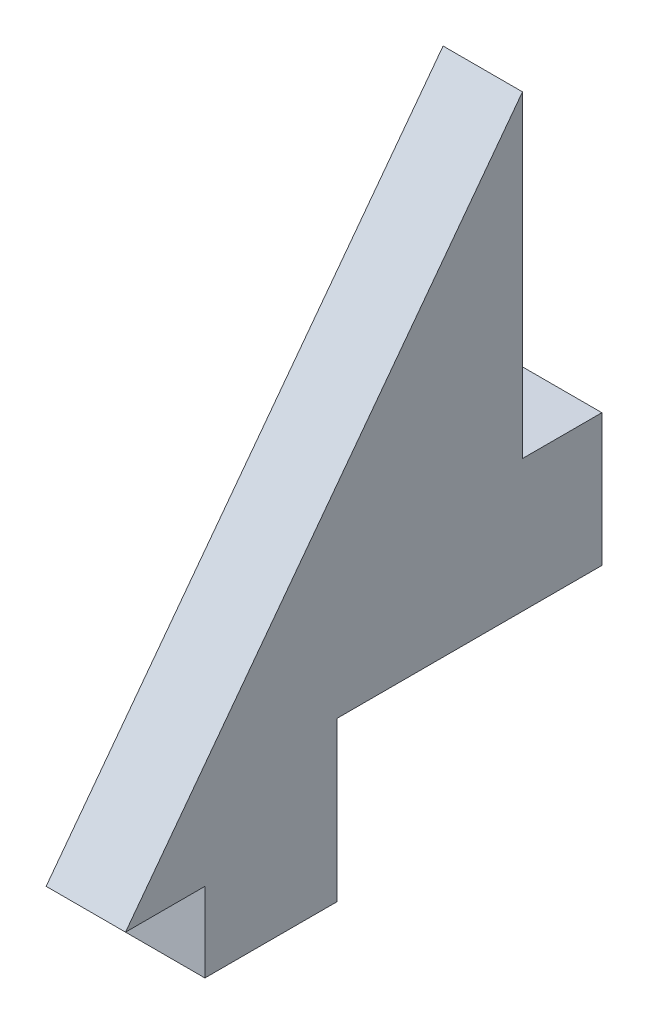
ISO-10303-21;
HEADER;
FILE_DESCRIPTION(('STEP AP214'),'2;1');
FILE_NAME('part.step','',(''),(''),'','','');
FILE_SCHEMA(('AUTOMOTIVE_DESIGN { 1 0 10303 214 1 1 1 1 }'));
ENDSEC;
DATA;
#1=APPLICATION_CONTEXT('core data for automotive mechanical design processes');
#2=APPLICATION_PROTOCOL_DEFINITION('international standard','automotive_design',2000,#1);
#3=PRODUCT_CONTEXT('',#1,'mechanical');
#4=PRODUCT('Part','Part','',(#3));
#5=PRODUCT_RELATED_PRODUCT_CATEGORY('part','',(#4));
#6=PRODUCT_DEFINITION_FORMATION('','',#4);
#7=PRODUCT_DEFINITION_CONTEXT('part definition',#1,'design');
#8=PRODUCT_DEFINITION('design','',#6,#7);
#9=PRODUCT_DEFINITION_SHAPE('','',#8);
#10=(LENGTH_UNIT() NAMED_UNIT(*) SI_UNIT(.MILLI.,.METRE.));
#11=(NAMED_UNIT(*) PLANE_ANGLE_UNIT() SI_UNIT($,.RADIAN.));
#12=(NAMED_UNIT(*) SI_UNIT($,.STERADIAN.) SOLID_ANGLE_UNIT());
#13=UNCERTAINTY_MEASURE_WITH_UNIT(LENGTH_MEASURE(1.E-05),#10,'distance_accuracy_value','');
#14=(GEOMETRIC_REPRESENTATION_CONTEXT(3) GLOBAL_UNCERTAINTY_ASSIGNED_CONTEXT((#13)) GLOBAL_UNIT_ASSIGNED_CONTEXT((#10,
#11,#12)) REPRESENTATION_CONTEXT('',''));
#15=CARTESIAN_POINT('',(0.,0.,0.));
#16=DIRECTION('',(0.,0.,1.));
#17=DIRECTION('',(1.,0.,0.));
#18=AXIS2_PLACEMENT_3D('',#15,#16,#17);
#19=CARTESIAN_POINT('',(3.,8.,0.));
#20=DIRECTION('',(0.,0.,1.));
#21=DIRECTION('',(0.,-1.,0.));
#22=AXIS2_PLACEMENT_3D('',#19,#20,#21);
#23=PLANE('',#22);
#24=DIRECTION('',(0.,1.,0.));
#25=VECTOR('',#24,1.);
#26=CARTESIAN_POINT('',(0.,8.,0.));
#27=LINE('',#26,#25);
#28=CARTESIAN_POINT('',(0.,8.,0.));
#29=VERTEX_POINT('',#28);
#30=CARTESIAN_POINT('',(0.,20.,0.));
#31=VERTEX_POINT('',#30);
#32=EDGE_CURVE('E138',#29,#31,#27,.T.);
#33=ORIENTED_EDGE('',*,*,#32,.T.);
#34=DIRECTION('',(-1.,0.,0.));
#35=VECTOR('',#34,1.);
#36=CARTESIAN_POINT('',(3.,20.,0.));
#37=LINE('',#36,#35);
#38=CARTESIAN_POINT('',(3.,20.,0.));
#39=VERTEX_POINT('',#38);
#40=EDGE_CURVE('E11',#39,#31,#37,.T.);
#41=ORIENTED_EDGE('',*,*,#40,.F.);
#42=DIRECTION('',(0.,1.,0.));
#43=VECTOR('',#42,1.);
#44=CARTESIAN_POINT('',(3.,8.,0.));
#45=LINE('',#44,#43);
#46=CARTESIAN_POINT('',(3.,8.,0.));
#47=VERTEX_POINT('',#46);
#48=EDGE_CURVE('E155',#47,#39,#45,.T.);
#49=ORIENTED_EDGE('',*,*,#48,.F.);
#50=DIRECTION('',(-1.,0.,0.));
#51=VECTOR('',#50,1.);
#52=CARTESIAN_POINT('',(3.,8.,0.));
#53=LINE('',#52,#51);
#54=EDGE_CURVE('E134',#47,#29,#53,.T.);
#55=ORIENTED_EDGE('',*,*,#54,.T.);
#56=EDGE_LOOP('',(#33,#41,#49,#55));
#57=FACE_BOUND('',#56,.T.);
#58=ADVANCED_FACE('F33',(#57),#23,.F.);
#59=CARTESIAN_POINT('',(3.,20.,0.));
#60=DIRECTION('',(0.,-0.6,-0.8));
#61=DIRECTION('',(0.,0.8,-0.6));
#62=AXIS2_PLACEMENT_3D('',#59,#60,#61);
#63=PLANE('',#62);
#64=DIRECTION('',(0.,-0.8,0.6));
#65=VECTOR('',#64,1.);
#66=CARTESIAN_POINT('',(0.,20.,0.));
#67=LINE('',#66,#65);
#68=CARTESIAN_POINT('',(0.,0.,15.));
#69=VERTEX_POINT('',#68);
#70=EDGE_CURVE('E141',#31,#69,#67,.T.);
#71=ORIENTED_EDGE('',*,*,#70,.T.);
#72=DIRECTION('',(-1.,0.,0.));
#73=VECTOR('',#72,1.);
#74=CARTESIAN_POINT('',(3.,0.,15.));
#75=LINE('',#74,#73);
#76=CARTESIAN_POINT('',(3.,0.,15.));
#77=VERTEX_POINT('',#76);
#78=EDGE_CURVE('E40',#77,#69,#75,.T.);
#79=ORIENTED_EDGE('',*,*,#78,.F.);
#80=DIRECTION('',(0.,-0.8,0.6));
#81=VECTOR('',#80,1.);
#82=CARTESIAN_POINT('',(3.,20.,0.));
#83=LINE('',#82,#81);
#84=EDGE_CURVE('E97',#39,#77,#83,.T.);
#85=ORIENTED_EDGE('',*,*,#84,.F.);
#86=ORIENTED_EDGE('',*,*,#40,.T.);
#87=EDGE_LOOP('',(#71,#79,#85,#86));
#88=FACE_BOUND('',#87,.T.);
#89=ADVANCED_FACE('F197',(#88),#63,.F.);
#90=CARTESIAN_POINT('',(3.,0.,15.));
#91=DIRECTION('',(0.,1.,0.));
#92=DIRECTION('',(0.,0.,1.));
#93=AXIS2_PLACEMENT_3D('',#90,#91,#92);
#94=PLANE('',#93);
#95=DIRECTION('',(0.,0.,-1.));
#96=VECTOR('',#95,1.);
#97=CARTESIAN_POINT('',(0.,0.,15.));
#98=LINE('',#97,#96);
#99=CARTESIAN_POINT('',(0.,0.,12.));
#100=VERTEX_POINT('',#99);
#101=EDGE_CURVE('E144',#69,#100,#98,.T.);
#102=ORIENTED_EDGE('',*,*,#101,.T.);
#103=DIRECTION('',(-1.,0.,0.));
#104=VECTOR('',#103,1.);
#105=CARTESIAN_POINT('',(3.,0.,12.));
#106=LINE('',#105,#104);
#107=CARTESIAN_POINT('',(3.,0.,12.));
#108=VERTEX_POINT('',#107);
#109=EDGE_CURVE('E162',#108,#100,#106,.T.);
#110=ORIENTED_EDGE('',*,*,#109,.F.);
#111=DIRECTION('',(0.,0.,-1.));
#112=VECTOR('',#111,1.);
#113=CARTESIAN_POINT('',(3.,0.,15.));
#114=LINE('',#113,#112);
#115=EDGE_CURVE('E170',#77,#108,#114,.T.);
#116=ORIENTED_EDGE('',*,*,#115,.F.);
#117=ORIENTED_EDGE('',*,*,#78,.T.);
#118=EDGE_LOOP('',(#102,#110,#116,#117));
#119=FACE_BOUND('',#118,.T.);
#120=ADVANCED_FACE('F168',(#119),#94,.F.);
#121=CARTESIAN_POINT('',(3.,0.,12.));
#122=DIRECTION('',(0.,0.,-1.));
#123=DIRECTION('',(-1.,0.,0.));
#124=AXIS2_PLACEMENT_3D('',#121,#122,#123);
#125=PLANE('',#124);
#126=DIRECTION('',(0.,-1.,0.));
#127=VECTOR('',#126,1.);
#128=CARTESIAN_POINT('',(0.,0.,12.));
#129=LINE('',#128,#127);
#130=CARTESIAN_POINT('',(0.,-3.,12.));
#131=VERTEX_POINT('',#130);
#132=EDGE_CURVE('E146',#100,#131,#129,.T.);
#133=ORIENTED_EDGE('',*,*,#132,.T.);
#134=DIRECTION('',(-1.,0.,0.));
#135=VECTOR('',#134,1.);
#136=CARTESIAN_POINT('',(3.,-3.,12.));
#137=LINE('',#136,#135);
#138=CARTESIAN_POINT('',(3.,-3.,12.));
#139=VERTEX_POINT('',#138);
#140=EDGE_CURVE('E159',#139,#131,#137,.T.);
#141=ORIENTED_EDGE('',*,*,#140,.F.);
#142=DIRECTION('',(0.,-1.,0.));
#143=VECTOR('',#142,1.);
#144=CARTESIAN_POINT('',(3.,0.,12.));
#145=LINE('',#144,#143);
#146=EDGE_CURVE('E185',#108,#139,#145,.T.);
#147=ORIENTED_EDGE('',*,*,#146,.F.);
#148=ORIENTED_EDGE('',*,*,#109,.T.);
#149=EDGE_LOOP('',(#133,#141,#147,#148));
#150=FACE_BOUND('',#149,.T.);
#151=ADVANCED_FACE('F178',(#150),#125,.F.);
#152=CARTESIAN_POINT('',(3.,-3.,12.));
#153=DIRECTION('',(0.,1.,0.));
#154=DIRECTION('',(0.,0.,1.));
#155=AXIS2_PLACEMENT_3D('',#152,#153,#154);
#156=PLANE('',#155);
#157=DIRECTION('',(0.,0.,-1.));
#158=VECTOR('',#157,1.);
#159=CARTESIAN_POINT('',(0.,-3.,12.));
#160=LINE('',#159,#158);
#161=CARTESIAN_POINT('',(0.,-3.,7.));
#162=VERTEX_POINT('',#161);
#163=EDGE_CURVE('E148',#131,#162,#160,.T.);
#164=ORIENTED_EDGE('',*,*,#163,.T.);
#165=DIRECTION('',(-1.,0.,0.));
#166=VECTOR('',#165,1.);
#167=CARTESIAN_POINT('',(3.,-3.,7.));
#168=LINE('',#167,#166);
#169=CARTESIAN_POINT('',(3.,-3.,7.));
#170=VERTEX_POINT('',#169);
#171=EDGE_CURVE('E129',#170,#162,#168,.T.);
#172=ORIENTED_EDGE('',*,*,#171,.F.);
#173=DIRECTION('',(0.,0.,-1.));
#174=VECTOR('',#173,1.);
#175=CARTESIAN_POINT('',(3.,-3.,12.));
#176=LINE('',#175,#174);
#177=EDGE_CURVE('E184',#139,#170,#176,.T.);
#178=ORIENTED_EDGE('',*,*,#177,.F.);
#179=ORIENTED_EDGE('',*,*,#140,.T.);
#180=EDGE_LOOP('',(#164,#172,#178,#179));
#181=FACE_BOUND('',#180,.T.);
#182=ADVANCED_FACE('F182',(#181),#156,.F.);
#183=CARTESIAN_POINT('',(3.,0.,7.));
#184=DIRECTION('',(0.,0.,1.));
#185=DIRECTION('',(1.,0.,0.));
#186=AXIS2_PLACEMENT_3D('',#183,#184,#185);
#187=PLANE('',#186);
#188=DIRECTION('',(0.,1.,0.));
#189=VECTOR('',#188,1.);
#190=CARTESIAN_POINT('',(0.,0.,7.));
#191=LINE('',#190,#189);
#192=CARTESIAN_POINT('',(0.,3.,7.));
#193=VERTEX_POINT('',#192);
#194=EDGE_CURVE('E47',#162,#193,#191,.T.);
#195=ORIENTED_EDGE('',*,*,#194,.T.);
#196=DIRECTION('',(1.,0.,0.));
#197=VECTOR('',#196,1.);
#198=CARTESIAN_POINT('',(-7.,3.,7.));
#199=LINE('',#198,#197);
#200=CARTESIAN_POINT('',(3.,3.,7.));
#201=VERTEX_POINT('',#200);
#202=EDGE_CURVE('E142',#193,#201,#199,.T.);
#203=ORIENTED_EDGE('',*,*,#202,.T.);
#204=DIRECTION('',(0.,1.,0.));
#205=VECTOR('',#204,1.);
#206=CARTESIAN_POINT('',(3.,0.,7.));
#207=LINE('',#206,#205);
#208=EDGE_CURVE('E119',#170,#201,#207,.T.);
#209=ORIENTED_EDGE('',*,*,#208,.F.);
#210=ORIENTED_EDGE('',*,*,#171,.T.);
#211=EDGE_LOOP('',(#195,#203,#209,#210));
#212=FACE_BOUND('',#211,.T.);
#213=ADVANCED_FACE('F192',(#212),#187,.F.);
#214=CARTESIAN_POINT('',(3.,3.,0.));
#215=DIRECTION('',(0.,1.,0.));
#216=DIRECTION('',(0.,0.,1.));
#217=AXIS2_PLACEMENT_3D('',#214,#215,#216);
#218=PLANE('',#217);
#219=DIRECTION('',(0.,0.,-1.));
#220=VECTOR('',#219,1.);
#221=CARTESIAN_POINT('',(0.,3.,0.));
#222=LINE('',#221,#220);
#223=CARTESIAN_POINT('',(0.,3.,-3.));
#224=VERTEX_POINT('',#223);
#225=EDGE_CURVE('E126',#193,#224,#222,.T.);
#226=ORIENTED_EDGE('',*,*,#225,.T.);
#227=DIRECTION('',(-1.,0.,0.));
#228=VECTOR('',#227,1.);
#229=CARTESIAN_POINT('',(3.,3.,-3.));
#230=LINE('',#229,#228);
#231=CARTESIAN_POINT('',(3.,3.,-3.));
#232=VERTEX_POINT('',#231);
#233=EDGE_CURVE('E124',#232,#224,#230,.T.);
#234=ORIENTED_EDGE('',*,*,#233,.F.);
#235=DIRECTION('',(0.,0.,-1.));
#236=VECTOR('',#235,1.);
#237=CARTESIAN_POINT('',(3.,3.,0.));
#238=LINE('',#237,#236);
#239=EDGE_CURVE('E112',#201,#232,#238,.T.);
#240=ORIENTED_EDGE('',*,*,#239,.F.);
#241=ORIENTED_EDGE('',*,*,#202,.F.);
#242=EDGE_LOOP('',(#226,#234,#240,#241));
#243=FACE_BOUND('',#242,.T.);
#244=ADVANCED_FACE('F125',(#243),#218,.F.);
#245=CARTESIAN_POINT('',(3.,3.,-3.));
#246=DIRECTION('',(0.,0.,1.));
#247=DIRECTION('',(1.,0.,0.));
#248=AXIS2_PLACEMENT_3D('',#245,#246,#247);
#249=PLANE('',#248);
#250=DIRECTION('',(0.,1.,0.));
#251=VECTOR('',#250,1.);
#252=CARTESIAN_POINT('',(0.,3.,-3.));
#253=LINE('',#252,#251);
#254=CARTESIAN_POINT('',(0.,8.,-3.));
#255=VERTEX_POINT('',#254);
#256=EDGE_CURVE('E152',#224,#255,#253,.T.);
#257=ORIENTED_EDGE('',*,*,#256,.T.);
#258=DIRECTION('',(-1.,0.,0.));
#259=VECTOR('',#258,1.);
#260=CARTESIAN_POINT('',(3.,8.,-3.));
#261=LINE('',#260,#259);
#262=CARTESIAN_POINT('',(3.,8.,-3.));
#263=VERTEX_POINT('',#262);
#264=EDGE_CURVE('E130',#263,#255,#261,.T.);
#265=ORIENTED_EDGE('',*,*,#264,.F.);
#266=DIRECTION('',(0.,1.,0.));
#267=VECTOR('',#266,1.);
#268=CARTESIAN_POINT('',(3.,3.,-3.));
#269=LINE('',#268,#267);
#270=EDGE_CURVE('E116',#232,#263,#269,.T.);
#271=ORIENTED_EDGE('',*,*,#270,.F.);
#272=ORIENTED_EDGE('',*,*,#233,.T.);
#273=EDGE_LOOP('',(#257,#265,#271,#272));
#274=FACE_BOUND('',#273,.T.);
#275=ADVANCED_FACE('F132',(#274),#249,.F.);
#276=CARTESIAN_POINT('',(3.,8.,0.));
#277=DIRECTION('',(0.,-1.,0.));
#278=DIRECTION('',(0.,0.,-1.));
#279=AXIS2_PLACEMENT_3D('',#276,#277,#278);
#280=PLANE('',#279);
#281=DIRECTION('',(0.,0.,1.));
#282=VECTOR('',#281,1.);
#283=CARTESIAN_POINT('',(0.,8.,0.));
#284=LINE('',#283,#282);
#285=EDGE_CURVE('E89',#255,#29,#284,.T.);
#286=ORIENTED_EDGE('',*,*,#285,.T.);
#287=ORIENTED_EDGE('',*,*,#54,.F.);
#288=DIRECTION('',(0.,0.,1.));
#289=VECTOR('',#288,1.);
#290=CARTESIAN_POINT('',(3.,8.,0.));
#291=LINE('',#290,#289);
#292=EDGE_CURVE('E56',#263,#47,#291,.T.);
#293=ORIENTED_EDGE('',*,*,#292,.F.);
#294=ORIENTED_EDGE('',*,*,#264,.T.);
#295=EDGE_LOOP('',(#286,#287,#293,#294));
#296=FACE_BOUND('',#295,.T.);
#297=ADVANCED_FACE('F193',(#296),#280,.F.);
#298=CARTESIAN_POINT('',(3.,0.,0.));
#299=DIRECTION('',(-1.,0.,0.));
#300=DIRECTION('',(0.,0.,1.));
#301=AXIS2_PLACEMENT_3D('',#298,#299,#300);
#302=PLANE('',#301);
#303=ORIENTED_EDGE('',*,*,#208,.T.);
#304=ORIENTED_EDGE('',*,*,#239,.T.);
#305=ORIENTED_EDGE('',*,*,#270,.T.);
#306=ORIENTED_EDGE('',*,*,#292,.T.);
#307=ORIENTED_EDGE('',*,*,#48,.T.);
#308=ORIENTED_EDGE('',*,*,#84,.T.);
#309=ORIENTED_EDGE('',*,*,#115,.T.);
#310=ORIENTED_EDGE('',*,*,#146,.T.);
#311=ORIENTED_EDGE('',*,*,#177,.T.);
#312=EDGE_LOOP('',(#303,#304,#305,#306,#307,#308,#309,#310,#311));
#313=FACE_BOUND('',#312,.T.);
#314=ADVANCED_FACE('F114',(#313),#302,.F.);
#315=CARTESIAN_POINT('',(0.,0.,0.));
#316=DIRECTION('',(-1.,0.,0.));
#317=DIRECTION('',(0.,0.,1.));
#318=AXIS2_PLACEMENT_3D('',#315,#316,#317);
#319=PLANE('',#318);
#320=ORIENTED_EDGE('',*,*,#225,.F.);
#321=ORIENTED_EDGE('',*,*,#194,.F.);
#322=ORIENTED_EDGE('',*,*,#163,.F.);
#323=ORIENTED_EDGE('',*,*,#132,.F.);
#324=ORIENTED_EDGE('',*,*,#101,.F.);
#325=ORIENTED_EDGE('',*,*,#70,.F.);
#326=ORIENTED_EDGE('',*,*,#32,.F.);
#327=ORIENTED_EDGE('',*,*,#285,.F.);
#328=ORIENTED_EDGE('',*,*,#256,.F.);
#329=EDGE_LOOP('',(#320,#321,#322,#323,#324,#325,#326,#327,#328));
#330=FACE_BOUND('',#329,.T.);
#331=ADVANCED_FACE('F173',(#330),#319,.T.);
#332=CLOSED_SHELL('',(#58,#89,#120,#151,#182,#213,#244,#275,#297,#314,#331));
#333=MANIFOLD_SOLID_BREP('B2',#332);
#334=ADVANCED_BREP_SHAPE_REPRESENTATION('',(#18,#333),#14);
#335=SHAPE_DEFINITION_REPRESENTATION(#9,#334);
ENDSEC;
END-ISO-10303-21;
